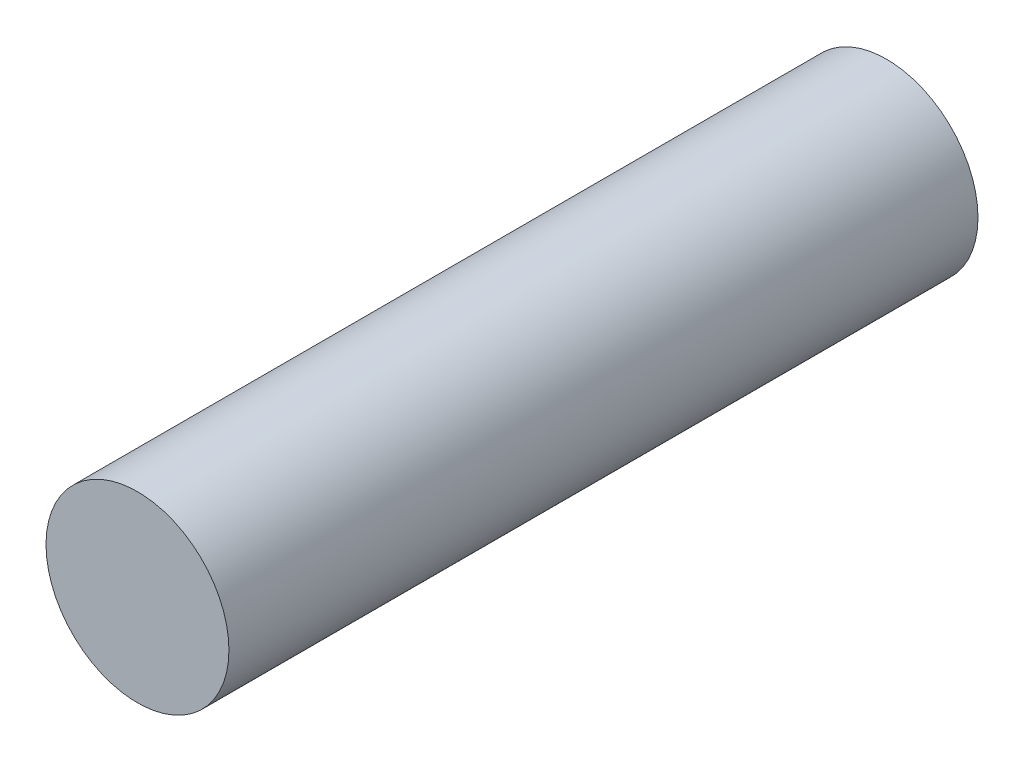
ISO-10303-21;
HEADER;
FILE_DESCRIPTION(('STEP AP214'),'2;1');
FILE_NAME('part.step','',(''),(''),'','','');
FILE_SCHEMA(('AUTOMOTIVE_DESIGN { 1 0 10303 214 1 1 1 1 }'));
ENDSEC;
DATA;
#1=APPLICATION_CONTEXT('core data for automotive mechanical design processes');
#2=APPLICATION_PROTOCOL_DEFINITION('international standard','automotive_design',2000,#1);
#3=PRODUCT_CONTEXT('',#1,'mechanical');
#4=PRODUCT('Part','Part','',(#3));
#5=PRODUCT_RELATED_PRODUCT_CATEGORY('part','',(#4));
#6=PRODUCT_DEFINITION_FORMATION('','',#4);
#7=PRODUCT_DEFINITION_CONTEXT('part definition',#1,'design');
#8=PRODUCT_DEFINITION('design','',#6,#7);
#9=PRODUCT_DEFINITION_SHAPE('','',#8);
#10=(LENGTH_UNIT() NAMED_UNIT(*) SI_UNIT(.MILLI.,.METRE.));
#11=(NAMED_UNIT(*) PLANE_ANGLE_UNIT() SI_UNIT($,.RADIAN.));
#12=(NAMED_UNIT(*) SI_UNIT($,.STERADIAN.) SOLID_ANGLE_UNIT());
#13=UNCERTAINTY_MEASURE_WITH_UNIT(LENGTH_MEASURE(1.E-05),#10,'distance_accuracy_value','');
#14=(GEOMETRIC_REPRESENTATION_CONTEXT(3) GLOBAL_UNCERTAINTY_ASSIGNED_CONTEXT((#13)) GLOBAL_UNIT_ASSIGNED_CONTEXT((#10,
#11,#12)) REPRESENTATION_CONTEXT('',''));
#15=CARTESIAN_POINT('',(0.,0.,0.));
#16=DIRECTION('',(0.,0.,1.));
#17=DIRECTION('',(1.,0.,0.));
#18=AXIS2_PLACEMENT_3D('',#15,#16,#17);
#19=CARTESIAN_POINT('',(0.,0.,34.9809153885677));
#20=DIRECTION('',(0.,0.,-1.));
#21=DIRECTION('',(-1.,0.,0.));
#22=AXIS2_PLACEMENT_3D('',#19,#20,#21);
#23=CYLINDRICAL_SURFACE('',#22,3.175);
#24=CARTESIAN_POINT('',(0.,0.,0.));
#25=DIRECTION('',(0.,0.,1.));
#26=DIRECTION('',(1.,0.,0.));
#27=AXIS2_PLACEMENT_3D('',#24,#25,#26);
#28=CIRCLE('',#27,3.175);
#29=CARTESIAN_POINT('',(3.175,0.,0.));
#30=VERTEX_POINT('',#29);
#31=EDGE_CURVE('E42',#30,#30,#28,.T.);
#32=ORIENTED_EDGE('',*,*,#31,.T.);
#33=EDGE_LOOP('',(#32));
#34=FACE_BOUND('',#33,.T.);
#35=CARTESIAN_POINT('',(0.,0.,26.0006592674986));
#36=DIRECTION('',(0.,0.,1.));
#37=DIRECTION('',(1.,0.,0.));
#38=AXIS2_PLACEMENT_3D('',#35,#36,#37);
#39=CIRCLE('',#38,3.175);
#40=CARTESIAN_POINT('',(3.175,0.,26.0006592674986));
#41=VERTEX_POINT('',#40);
#42=EDGE_CURVE('E10',#41,#41,#39,.T.);
#43=ORIENTED_EDGE('',*,*,#42,.F.);
#44=EDGE_LOOP('',(#43));
#45=FACE_BOUND('',#44,.T.);
#46=ADVANCED_FACE('F35',(#34,#45),#23,.T.);
#47=CARTESIAN_POINT('',(0.,0.,0.));
#48=DIRECTION('',(0.,0.,1.));
#49=DIRECTION('',(1.,0.,0.));
#50=AXIS2_PLACEMENT_3D('',#47,#48,#49);
#51=PLANE('',#50);
#52=ORIENTED_EDGE('',*,*,#31,.F.);
#53=EDGE_LOOP('',(#52));
#54=FACE_BOUND('',#53,.T.);
#55=ADVANCED_FACE('F50',(#54),#51,.F.);
#56=CARTESIAN_POINT('',(-71.8,2.12503625807159E-13,26.0006592674986));
#57=DIRECTION('',(0.,0.,1.));
#58=DIRECTION('',(1.,0.,0.));
#59=AXIS2_PLACEMENT_3D('',#56,#57,#58);
#60=PLANE('',#59);
#61=ORIENTED_EDGE('',*,*,#42,.T.);
#62=EDGE_LOOP('',(#61));
#63=FACE_BOUND('',#62,.T.);
#64=ADVANCED_FACE('F37',(#63),#60,.T.);
#65=CLOSED_SHELL('',(#46,#55,#64));
#66=MANIFOLD_SOLID_BREP('B2',#65);
#67=ADVANCED_BREP_SHAPE_REPRESENTATION('',(#18,#66),#14);
#68=SHAPE_DEFINITION_REPRESENTATION(#9,#67);
ENDSEC;
END-ISO-10303-21;
